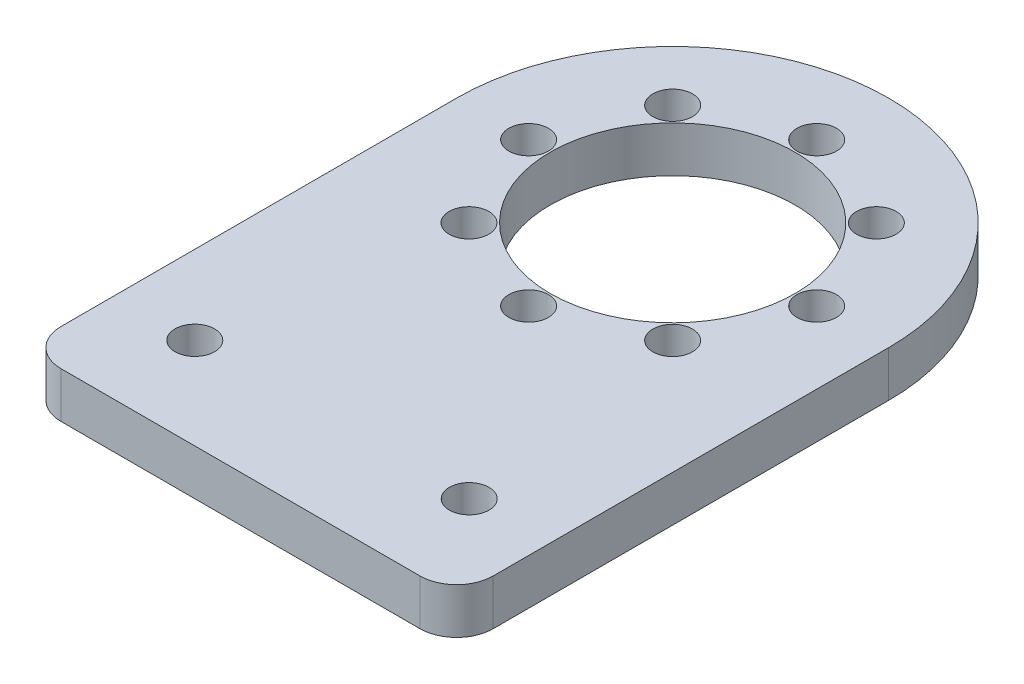
ISO-10303-21;
HEADER;
FILE_DESCRIPTION(('STEP AP214'),'2;1');
FILE_NAME('part.step','',(''),(''),'','','');
FILE_SCHEMA(('AUTOMOTIVE_DESIGN { 1 0 10303 214 1 1 1 1 }'));
ENDSEC;
DATA;
#1=APPLICATION_CONTEXT('core data for automotive mechanical design processes');
#2=APPLICATION_PROTOCOL_DEFINITION('international standard','automotive_design',2000,#1);
#3=PRODUCT_CONTEXT('',#1,'mechanical');
#4=PRODUCT('Part','Part','',(#3));
#5=PRODUCT_RELATED_PRODUCT_CATEGORY('part','',(#4));
#6=PRODUCT_DEFINITION_FORMATION('','',#4);
#7=PRODUCT_DEFINITION_CONTEXT('part definition',#1,'design');
#8=PRODUCT_DEFINITION('design','',#6,#7);
#9=PRODUCT_DEFINITION_SHAPE('','',#8);
#10=(LENGTH_UNIT() NAMED_UNIT(*) SI_UNIT(.MILLI.,.METRE.));
#11=(NAMED_UNIT(*) PLANE_ANGLE_UNIT() SI_UNIT($,.RADIAN.));
#12=(NAMED_UNIT(*) SI_UNIT($,.STERADIAN.) SOLID_ANGLE_UNIT());
#13=UNCERTAINTY_MEASURE_WITH_UNIT(LENGTH_MEASURE(1.E-05),#10,'distance_accuracy_value','');
#14=(GEOMETRIC_REPRESENTATION_CONTEXT(3) GLOBAL_UNCERTAINTY_ASSIGNED_CONTEXT((#13)) GLOBAL_UNIT_ASSIGNED_CONTEXT((#10,
#11,#12)) REPRESENTATION_CONTEXT('',''));
#15=CARTESIAN_POINT('',(0.,0.,0.));
#16=DIRECTION('',(0.,0.,1.));
#17=DIRECTION('',(1.,0.,0.));
#18=AXIS2_PLACEMENT_3D('',#15,#16,#17);
#19=CARTESIAN_POINT('',(0.,6.35,0.));
#20=DIRECTION('',(-1.,0.,0.));
#21=DIRECTION('',(0.,0.,1.));
#22=AXIS2_PLACEMENT_3D('',#19,#20,#21);
#23=PLANE('',#22);
#24=DIRECTION('',(0.,0.,-1.));
#25=VECTOR('',#24,1.);
#26=CARTESIAN_POINT('',(0.,0.,0.));
#27=LINE('',#26,#25);
#28=CARTESIAN_POINT('',(0.,0.,-5.08));
#29=VERTEX_POINT('',#28);
#30=CARTESIAN_POINT('',(0.,0.,-60.));
#31=VERTEX_POINT('',#30);
#32=EDGE_CURVE('E116',#29,#31,#27,.T.);
#33=ORIENTED_EDGE('',*,*,#32,.F.);
#34=DIRECTION('',(0.,-1.,0.));
#35=VECTOR('',#34,1.);
#36=CARTESIAN_POINT('',(0.,6.35,-5.08));
#37=LINE('',#36,#35);
#38=CARTESIAN_POINT('',(0.,6.35,-5.08));
#39=VERTEX_POINT('',#38);
#40=EDGE_CURVE('E11',#29,#39,#37,.F.);
#41=ORIENTED_EDGE('',*,*,#40,.T.);
#42=DIRECTION('',(0.,0.,-1.));
#43=VECTOR('',#42,1.);
#44=CARTESIAN_POINT('',(0.,6.35,0.));
#45=LINE('',#44,#43);
#46=CARTESIAN_POINT('',(0.,6.35,-60.));
#47=VERTEX_POINT('',#46);
#48=EDGE_CURVE('E123',#39,#47,#45,.T.);
#49=ORIENTED_EDGE('',*,*,#48,.T.);
#50=DIRECTION('',(0.,-1.,0.));
#51=VECTOR('',#50,1.);
#52=CARTESIAN_POINT('',(0.,6.35,-60.));
#53=LINE('',#52,#51);
#54=EDGE_CURVE('E108',#47,#31,#53,.T.);
#55=ORIENTED_EDGE('',*,*,#54,.T.);
#56=EDGE_LOOP('',(#33,#41,#49,#55));
#57=FACE_BOUND('',#56,.T.);
#58=ADVANCED_FACE('F33',(#57),#23,.T.);
#59=CARTESIAN_POINT('',(0.,6.35,0.));
#60=DIRECTION('',(0.,0.,-1.));
#61=DIRECTION('',(-1.,0.,0.));
#62=AXIS2_PLACEMENT_3D('',#59,#60,#61);
#63=PLANE('',#62);
#64=DIRECTION('',(1.,0.,0.));
#65=VECTOR('',#64,1.);
#66=CARTESIAN_POINT('',(0.,0.,0.));
#67=LINE('',#66,#65);
#68=CARTESIAN_POINT('',(5.08,0.,0.));
#69=VERTEX_POINT('',#68);
#70=CARTESIAN_POINT('',(54.92,0.,0.));
#71=VERTEX_POINT('',#70);
#72=EDGE_CURVE('E118',#69,#71,#67,.T.);
#73=ORIENTED_EDGE('',*,*,#72,.T.);
#74=DIRECTION('',(0.,-1.,0.));
#75=VECTOR('',#74,1.);
#76=CARTESIAN_POINT('',(54.92,6.35,0.));
#77=LINE('',#76,#75);
#78=CARTESIAN_POINT('',(54.92,6.35,0.));
#79=VERTEX_POINT('',#78);
#80=EDGE_CURVE('E54',#71,#79,#77,.F.);
#81=ORIENTED_EDGE('',*,*,#80,.T.);
#82=DIRECTION('',(1.,0.,0.));
#83=VECTOR('',#82,1.);
#84=CARTESIAN_POINT('',(0.,6.35,0.));
#85=LINE('',#84,#83);
#86=CARTESIAN_POINT('',(5.08,6.35,0.));
#87=VERTEX_POINT('',#86);
#88=EDGE_CURVE('E97',#87,#79,#85,.T.);
#89=ORIENTED_EDGE('',*,*,#88,.F.);
#90=DIRECTION('',(0.,-1.,0.));
#91=VECTOR('',#90,1.);
#92=CARTESIAN_POINT('',(5.08,0.,0.));
#93=LINE('',#92,#91);
#94=EDGE_CURVE('E130',#87,#69,#93,.T.);
#95=ORIENTED_EDGE('',*,*,#94,.T.);
#96=EDGE_LOOP('',(#73,#81,#89,#95));
#97=FACE_BOUND('',#96,.T.);
#98=ADVANCED_FACE('F138',(#97),#63,.F.);
#99=CARTESIAN_POINT('',(60.,6.35,0.));
#100=DIRECTION('',(-1.,0.,0.));
#101=DIRECTION('',(0.,0.,1.));
#102=AXIS2_PLACEMENT_3D('',#99,#100,#101);
#103=PLANE('',#102);
#104=DIRECTION('',(0.,0.,-1.));
#105=VECTOR('',#104,1.);
#106=CARTESIAN_POINT('',(60.,6.35,0.));
#107=LINE('',#106,#105);
#108=CARTESIAN_POINT('',(60.,6.35,-5.08));
#109=VERTEX_POINT('',#108);
#110=CARTESIAN_POINT('',(60.,6.35,-60.));
#111=VERTEX_POINT('',#110);
#112=EDGE_CURVE('E87',#109,#111,#107,.T.);
#113=ORIENTED_EDGE('',*,*,#112,.F.);
#114=DIRECTION('',(0.,-1.,0.));
#115=VECTOR('',#114,1.);
#116=CARTESIAN_POINT('',(60.,6.35,-5.08));
#117=LINE('',#116,#115);
#118=CARTESIAN_POINT('',(60.,0.,-5.08));
#119=VERTEX_POINT('',#118);
#120=EDGE_CURVE('E107',#109,#119,#117,.T.);
#121=ORIENTED_EDGE('',*,*,#120,.T.);
#122=DIRECTION('',(0.,0.,-1.));
#123=VECTOR('',#122,1.);
#124=CARTESIAN_POINT('',(60.,0.,0.));
#125=LINE('',#124,#123);
#126=CARTESIAN_POINT('',(60.,0.,-60.));
#127=VERTEX_POINT('',#126);
#128=EDGE_CURVE('E103',#119,#127,#125,.T.);
#129=ORIENTED_EDGE('',*,*,#128,.T.);
#130=DIRECTION('',(0.,-1.,0.));
#131=VECTOR('',#130,1.);
#132=CARTESIAN_POINT('',(60.,6.35,-60.));
#133=LINE('',#132,#131);
#134=EDGE_CURVE('E100',#111,#127,#133,.T.);
#135=ORIENTED_EDGE('',*,*,#134,.F.);
#136=EDGE_LOOP('',(#113,#121,#129,#135));
#137=FACE_BOUND('',#136,.T.);
#138=ADVANCED_FACE('F101',(#137),#103,.F.);
#139=CARTESIAN_POINT('',(30.,6.35,-60.));
#140=DIRECTION('',(0.,-1.,0.));
#141=DIRECTION('',(0.,0.,-1.));
#142=AXIS2_PLACEMENT_3D('',#139,#140,#141);
#143=CYLINDRICAL_SURFACE('',#142,30.);
#144=CARTESIAN_POINT('',(30.,0.,-60.));
#145=DIRECTION('',(0.,1.,0.));
#146=DIRECTION('',(0.,0.,1.));
#147=AXIS2_PLACEMENT_3D('',#144,#145,#146);
#148=CIRCLE('',#147,30.);
#149=EDGE_CURVE('E122',#127,#31,#148,.T.);
#150=ORIENTED_EDGE('',*,*,#149,.T.);
#151=ORIENTED_EDGE('',*,*,#54,.F.);
#152=CARTESIAN_POINT('',(30.,6.35,-60.));
#153=DIRECTION('',(0.,1.,0.));
#154=DIRECTION('',(0.,0.,1.));
#155=AXIS2_PLACEMENT_3D('',#152,#153,#154);
#156=CIRCLE('',#155,30.);
#157=EDGE_CURVE('E91',#111,#47,#156,.T.);
#158=ORIENTED_EDGE('',*,*,#157,.F.);
#159=ORIENTED_EDGE('',*,*,#134,.T.);
#160=EDGE_LOOP('',(#150,#151,#158,#159));
#161=FACE_BOUND('',#160,.T.);
#162=ADVANCED_FACE('F110',(#161),#143,.T.);
#163=CARTESIAN_POINT('',(0.,6.35,0.));
#164=DIRECTION('',(0.,1.,0.));
#165=DIRECTION('',(0.,0.,1.));
#166=AXIS2_PLACEMENT_3D('',#163,#164,#165);
#167=PLANE('',#166);
#168=CARTESIAN_POINT('',(10.95,6.35,-12.7));
#169=DIRECTION('',(0.,1.,0.));
#170=DIRECTION('',(0.,0.,1.));
#171=AXIS2_PLACEMENT_3D('',#168,#169,#170);
#172=CIRCLE('',#171,2.74999999999999);
#173=CARTESIAN_POINT('',(10.95,6.35,-9.95000000000001));
#174=VERTEX_POINT('',#173);
#175=EDGE_CURVE('E223',#174,#174,#172,.T.);
#176=ORIENTED_EDGE('',*,*,#175,.F.);
#177=EDGE_LOOP('',(#176));
#178=FACE_BOUND('',#177,.T.);
#179=CARTESIAN_POINT('',(49.05,6.35,-12.7));
#180=DIRECTION('',(0.,1.,0.));
#181=DIRECTION('',(0.,0.,1.));
#182=AXIS2_PLACEMENT_3D('',#179,#180,#181);
#183=CIRCLE('',#182,2.74999999999999);
#184=CARTESIAN_POINT('',(49.05,6.35,-9.95000000000002));
#185=VERTEX_POINT('',#184);
#186=EDGE_CURVE('E216',#185,#185,#183,.T.);
#187=ORIENTED_EDGE('',*,*,#186,.F.);
#188=EDGE_LOOP('',(#187));
#189=FACE_BOUND('',#188,.T.);
#190=CARTESIAN_POINT('',(15.8578643762691,6.35,-74.142135623731));
#191=DIRECTION('',(0.,1.,0.));
#192=DIRECTION('',(0.,0.,1.));
#193=AXIS2_PLACEMENT_3D('',#190,#191,#192);
#194=CIRCLE('',#193,2.75);
#195=CARTESIAN_POINT('',(15.8578643762691,6.35,-71.392135623731));
#196=VERTEX_POINT('',#195);
#197=EDGE_CURVE('E220',#196,#196,#194,.T.);
#198=ORIENTED_EDGE('',*,*,#197,.F.);
#199=EDGE_LOOP('',(#198));
#200=FACE_BOUND('',#199,.T.);
#201=CARTESIAN_POINT('',(44.1421356237309,6.35,-45.857864376269));
#202=DIRECTION('',(0.,1.,0.));
#203=DIRECTION('',(0.,0.,1.));
#204=AXIS2_PLACEMENT_3D('',#201,#202,#203);
#205=CIRCLE('',#204,2.75);
#206=CARTESIAN_POINT('',(44.1421356237309,6.35,-43.107864376269));
#207=VERTEX_POINT('',#206);
#208=EDGE_CURVE('E232',#207,#207,#205,.T.);
#209=ORIENTED_EDGE('',*,*,#208,.F.);
#210=EDGE_LOOP('',(#209));
#211=FACE_BOUND('',#210,.T.);
#212=CARTESIAN_POINT('',(44.142135623731,6.35,-74.1421356237309));
#213=DIRECTION('',(0.,1.,0.));
#214=DIRECTION('',(0.,0.,1.));
#215=AXIS2_PLACEMENT_3D('',#212,#213,#214);
#216=CIRCLE('',#215,2.75);
#217=CARTESIAN_POINT('',(44.142135623731,6.35,-71.3921356237309));
#218=VERTEX_POINT('',#217);
#219=EDGE_CURVE('E238',#218,#218,#216,.T.);
#220=ORIENTED_EDGE('',*,*,#219,.F.);
#221=EDGE_LOOP('',(#220));
#222=FACE_BOUND('',#221,.T.);
#223=CARTESIAN_POINT('',(15.857864376269,6.35,-45.8578643762691));
#224=DIRECTION('',(0.,1.,0.));
#225=DIRECTION('',(0.,0.,1.));
#226=AXIS2_PLACEMENT_3D('',#223,#224,#225);
#227=CIRCLE('',#226,2.75);
#228=CARTESIAN_POINT('',(15.857864376269,6.35,-43.1078643762691));
#229=VERTEX_POINT('',#228);
#230=EDGE_CURVE('E244',#229,#229,#227,.T.);
#231=ORIENTED_EDGE('',*,*,#230,.F.);
#232=EDGE_LOOP('',(#231));
#233=FACE_BOUND('',#232,.T.);
#234=CARTESIAN_POINT('',(30.,6.35,-80.));
#235=DIRECTION('',(0.,1.,0.));
#236=DIRECTION('',(0.,0.,1.));
#237=AXIS2_PLACEMENT_3D('',#234,#235,#236);
#238=CIRCLE('',#237,2.75);
#239=CARTESIAN_POINT('',(30.,6.35,-77.25));
#240=VERTEX_POINT('',#239);
#241=EDGE_CURVE('E250',#240,#240,#238,.T.);
#242=ORIENTED_EDGE('',*,*,#241,.F.);
#243=EDGE_LOOP('',(#242));
#244=FACE_BOUND('',#243,.T.);
#245=CARTESIAN_POINT('',(50.,6.35,-60.));
#246=DIRECTION('',(0.,1.,0.));
#247=DIRECTION('',(0.,0.,1.));
#248=AXIS2_PLACEMENT_3D('',#245,#246,#247);
#249=CIRCLE('',#248,2.75);
#250=CARTESIAN_POINT('',(50.,6.35,-57.25));
#251=VERTEX_POINT('',#250);
#252=EDGE_CURVE('E256',#251,#251,#249,.T.);
#253=ORIENTED_EDGE('',*,*,#252,.F.);
#254=EDGE_LOOP('',(#253));
#255=FACE_BOUND('',#254,.T.);
#256=CARTESIAN_POINT('',(30.,6.35,-40.));
#257=DIRECTION('',(0.,1.,0.));
#258=DIRECTION('',(0.,0.,1.));
#259=AXIS2_PLACEMENT_3D('',#256,#257,#258);
#260=CIRCLE('',#259,2.75);
#261=CARTESIAN_POINT('',(30.,6.35,-37.25));
#262=VERTEX_POINT('',#261);
#263=EDGE_CURVE('E262',#262,#262,#260,.T.);
#264=ORIENTED_EDGE('',*,*,#263,.F.);
#265=EDGE_LOOP('',(#264));
#266=FACE_BOUND('',#265,.T.);
#267=CARTESIAN_POINT('',(9.99999999999999,6.35,-60.));
#268=DIRECTION('',(0.,1.,0.));
#269=DIRECTION('',(0.,0.,1.));
#270=AXIS2_PLACEMENT_3D('',#267,#268,#269);
#271=CIRCLE('',#270,2.75);
#272=CARTESIAN_POINT('',(9.99999999999999,6.35,-57.25));
#273=VERTEX_POINT('',#272);
#274=EDGE_CURVE('E268',#273,#273,#271,.T.);
#275=ORIENTED_EDGE('',*,*,#274,.F.);
#276=EDGE_LOOP('',(#275));
#277=FACE_BOUND('',#276,.T.);
#278=CARTESIAN_POINT('',(30.,6.35,-60.));
#279=DIRECTION('',(0.,1.,0.));
#280=DIRECTION('',(0.,0.,1.));
#281=AXIS2_PLACEMENT_3D('',#278,#279,#280);
#282=CIRCLE('',#281,17.);
#283=CARTESIAN_POINT('',(30.,6.35,-43.));
#284=VERTEX_POINT('',#283);
#285=EDGE_CURVE('E274',#284,#284,#282,.T.);
#286=ORIENTED_EDGE('',*,*,#285,.F.);
#287=EDGE_LOOP('',(#286));
#288=FACE_BOUND('',#287,.T.);
#289=ORIENTED_EDGE('',*,*,#88,.T.);
#290=CARTESIAN_POINT('',(54.92,6.35,-5.08));
#291=DIRECTION('',(0.,1.,0.));
#292=DIRECTION('',(0.,0.,1.));
#293=AXIS2_PLACEMENT_3D('',#290,#291,#292);
#294=CIRCLE('',#293,5.08);
#295=EDGE_CURVE('E41',#79,#109,#294,.T.);
#296=ORIENTED_EDGE('',*,*,#295,.T.);
#297=ORIENTED_EDGE('',*,*,#112,.T.);
#298=ORIENTED_EDGE('',*,*,#157,.T.);
#299=ORIENTED_EDGE('',*,*,#48,.F.);
#300=CARTESIAN_POINT('',(5.08,6.35,-5.08));
#301=DIRECTION('',(0.,1.,0.));
#302=DIRECTION('',(0.,0.,1.));
#303=AXIS2_PLACEMENT_3D('',#300,#301,#302);
#304=CIRCLE('',#303,5.08);
#305=EDGE_CURVE('E134',#39,#87,#304,.T.);
#306=ORIENTED_EDGE('',*,*,#305,.T.);
#307=EDGE_LOOP('',(#289,#296,#297,#298,#299,#306));
#308=FACE_BOUND('',#307,.T.);
#309=ADVANCED_FACE('F89',(#178,#189,#200,#211,#222,#233,#244,#255,#266,#277,#288,#308),#167,.T.);
#310=CARTESIAN_POINT('',(0.,0.,0.));
#311=DIRECTION('',(0.,1.,0.));
#312=DIRECTION('',(0.,0.,1.));
#313=AXIS2_PLACEMENT_3D('',#310,#311,#312);
#314=PLANE('',#313);
#315=CARTESIAN_POINT('',(10.95,0.,-12.7));
#316=DIRECTION('',(0.,1.,0.));
#317=DIRECTION('',(0.,0.,1.));
#318=AXIS2_PLACEMENT_3D('',#315,#316,#317);
#319=CIRCLE('',#318,2.75);
#320=CARTESIAN_POINT('',(10.95,0.,-9.95));
#321=VERTEX_POINT('',#320);
#322=EDGE_CURVE('E218',#321,#321,#319,.T.);
#323=ORIENTED_EDGE('',*,*,#322,.T.);
#324=EDGE_LOOP('',(#323));
#325=FACE_BOUND('',#324,.T.);
#326=CARTESIAN_POINT('',(49.05,0.,-12.7));
#327=DIRECTION('',(0.,1.,0.));
#328=DIRECTION('',(0.,0.,1.));
#329=AXIS2_PLACEMENT_3D('',#326,#327,#328);
#330=CIRCLE('',#329,2.75);
#331=CARTESIAN_POINT('',(49.05,0.,-9.95000000000001));
#332=VERTEX_POINT('',#331);
#333=EDGE_CURVE('E213',#332,#332,#330,.T.);
#334=ORIENTED_EDGE('',*,*,#333,.T.);
#335=EDGE_LOOP('',(#334));
#336=FACE_BOUND('',#335,.T.);
#337=CARTESIAN_POINT('',(15.8578643762691,0.,-74.142135623731));
#338=DIRECTION('',(0.,1.,0.));
#339=DIRECTION('',(0.,0.,1.));
#340=AXIS2_PLACEMENT_3D('',#337,#338,#339);
#341=CIRCLE('',#340,2.75);
#342=CARTESIAN_POINT('',(15.8578643762691,0.,-71.392135623731));
#343=VERTEX_POINT('',#342);
#344=EDGE_CURVE('E229',#343,#343,#341,.T.);
#345=ORIENTED_EDGE('',*,*,#344,.T.);
#346=EDGE_LOOP('',(#345));
#347=FACE_BOUND('',#346,.T.);
#348=CARTESIAN_POINT('',(44.1421356237309,0.,-45.857864376269));
#349=DIRECTION('',(0.,1.,0.));
#350=DIRECTION('',(0.,0.,1.));
#351=AXIS2_PLACEMENT_3D('',#348,#349,#350);
#352=CIRCLE('',#351,2.75);
#353=CARTESIAN_POINT('',(44.1421356237309,0.,-43.107864376269));
#354=VERTEX_POINT('',#353);
#355=EDGE_CURVE('E235',#354,#354,#352,.T.);
#356=ORIENTED_EDGE('',*,*,#355,.T.);
#357=EDGE_LOOP('',(#356));
#358=FACE_BOUND('',#357,.T.);
#359=CARTESIAN_POINT('',(44.142135623731,0.,-74.1421356237309));
#360=DIRECTION('',(0.,1.,0.));
#361=DIRECTION('',(0.,0.,1.));
#362=AXIS2_PLACEMENT_3D('',#359,#360,#361);
#363=CIRCLE('',#362,2.75);
#364=CARTESIAN_POINT('',(44.142135623731,0.,-71.3921356237309));
#365=VERTEX_POINT('',#364);
#366=EDGE_CURVE('E241',#365,#365,#363,.T.);
#367=ORIENTED_EDGE('',*,*,#366,.T.);
#368=EDGE_LOOP('',(#367));
#369=FACE_BOUND('',#368,.T.);
#370=CARTESIAN_POINT('',(15.857864376269,0.,-45.8578643762691));
#371=DIRECTION('',(0.,1.,0.));
#372=DIRECTION('',(0.,0.,1.));
#373=AXIS2_PLACEMENT_3D('',#370,#371,#372);
#374=CIRCLE('',#373,2.75);
#375=CARTESIAN_POINT('',(15.857864376269,0.,-43.1078643762691));
#376=VERTEX_POINT('',#375);
#377=EDGE_CURVE('E247',#376,#376,#374,.T.);
#378=ORIENTED_EDGE('',*,*,#377,.T.);
#379=EDGE_LOOP('',(#378));
#380=FACE_BOUND('',#379,.T.);
#381=CARTESIAN_POINT('',(30.,0.,-80.));
#382=DIRECTION('',(0.,1.,0.));
#383=DIRECTION('',(0.,0.,1.));
#384=AXIS2_PLACEMENT_3D('',#381,#382,#383);
#385=CIRCLE('',#384,2.75);
#386=CARTESIAN_POINT('',(30.,0.,-77.25));
#387=VERTEX_POINT('',#386);
#388=EDGE_CURVE('E253',#387,#387,#385,.T.);
#389=ORIENTED_EDGE('',*,*,#388,.T.);
#390=EDGE_LOOP('',(#389));
#391=FACE_BOUND('',#390,.T.);
#392=CARTESIAN_POINT('',(50.,0.,-60.));
#393=DIRECTION('',(0.,1.,0.));
#394=DIRECTION('',(0.,0.,1.));
#395=AXIS2_PLACEMENT_3D('',#392,#393,#394);
#396=CIRCLE('',#395,2.75);
#397=CARTESIAN_POINT('',(50.,0.,-57.25));
#398=VERTEX_POINT('',#397);
#399=EDGE_CURVE('E259',#398,#398,#396,.T.);
#400=ORIENTED_EDGE('',*,*,#399,.T.);
#401=EDGE_LOOP('',(#400));
#402=FACE_BOUND('',#401,.T.);
#403=CARTESIAN_POINT('',(30.,0.,-40.));
#404=DIRECTION('',(0.,1.,0.));
#405=DIRECTION('',(0.,0.,1.));
#406=AXIS2_PLACEMENT_3D('',#403,#404,#405);
#407=CIRCLE('',#406,2.75);
#408=CARTESIAN_POINT('',(30.,0.,-37.25));
#409=VERTEX_POINT('',#408);
#410=EDGE_CURVE('E265',#409,#409,#407,.T.);
#411=ORIENTED_EDGE('',*,*,#410,.T.);
#412=EDGE_LOOP('',(#411));
#413=FACE_BOUND('',#412,.T.);
#414=CARTESIAN_POINT('',(9.99999999999999,0.,-60.));
#415=DIRECTION('',(0.,1.,0.));
#416=DIRECTION('',(0.,0.,1.));
#417=AXIS2_PLACEMENT_3D('',#414,#415,#416);
#418=CIRCLE('',#417,2.75);
#419=CARTESIAN_POINT('',(9.99999999999999,0.,-57.25));
#420=VERTEX_POINT('',#419);
#421=EDGE_CURVE('E271',#420,#420,#418,.T.);
#422=ORIENTED_EDGE('',*,*,#421,.T.);
#423=EDGE_LOOP('',(#422));
#424=FACE_BOUND('',#423,.T.);
#425=CARTESIAN_POINT('',(30.,0.,-60.));
#426=DIRECTION('',(0.,1.,0.));
#427=DIRECTION('',(0.,0.,1.));
#428=AXIS2_PLACEMENT_3D('',#425,#426,#427);
#429=CIRCLE('',#428,17.);
#430=CARTESIAN_POINT('',(30.,0.,-43.));
#431=VERTEX_POINT('',#430);
#432=EDGE_CURVE('E119',#431,#431,#429,.T.);
#433=ORIENTED_EDGE('',*,*,#432,.T.);
#434=EDGE_LOOP('',(#433));
#435=FACE_BOUND('',#434,.T.);
#436=ORIENTED_EDGE('',*,*,#128,.F.);
#437=CARTESIAN_POINT('',(54.92,0.,-5.08));
#438=DIRECTION('',(0.,1.,0.));
#439=DIRECTION('',(0.,0.,1.));
#440=AXIS2_PLACEMENT_3D('',#437,#438,#439);
#441=CIRCLE('',#440,5.08);
#442=EDGE_CURVE('E128',#119,#71,#441,.F.);
#443=ORIENTED_EDGE('',*,*,#442,.T.);
#444=ORIENTED_EDGE('',*,*,#72,.F.);
#445=CARTESIAN_POINT('',(5.08,0.,-5.08));
#446=DIRECTION('',(0.,1.,0.));
#447=DIRECTION('',(0.,0.,1.));
#448=AXIS2_PLACEMENT_3D('',#445,#446,#447);
#449=CIRCLE('',#448,5.08);
#450=EDGE_CURVE('E126',#69,#29,#449,.F.);
#451=ORIENTED_EDGE('',*,*,#450,.T.);
#452=ORIENTED_EDGE('',*,*,#32,.T.);
#453=ORIENTED_EDGE('',*,*,#149,.F.);
#454=EDGE_LOOP('',(#436,#443,#444,#451,#452,#453));
#455=FACE_BOUND('',#454,.T.);
#456=ADVANCED_FACE('F141',(#325,#336,#347,#358,#369,#380,#391,#402,#413,#424,#435,#455),#314,.F.);
#457=CARTESIAN_POINT('',(30.,0.,-60.));
#458=DIRECTION('',(0.,1.,0.));
#459=DIRECTION('',(0.,0.,1.));
#460=AXIS2_PLACEMENT_3D('',#457,#458,#459);
#461=CYLINDRICAL_SURFACE('',#460,17.);
#462=ORIENTED_EDGE('',*,*,#432,.F.);
#463=EDGE_LOOP('',(#462));
#464=FACE_BOUND('',#463,.T.);
#465=ORIENTED_EDGE('',*,*,#285,.T.);
#466=EDGE_LOOP('',(#465));
#467=FACE_BOUND('',#466,.T.);
#468=ADVANCED_FACE('F166',(#464,#467),#461,.F.);
#469=CARTESIAN_POINT('',(9.99999999999999,6.35,-60.));
#470=DIRECTION('',(0.,1.,0.));
#471=DIRECTION('',(0.,0.,1.));
#472=AXIS2_PLACEMENT_3D('',#469,#470,#471);
#473=CYLINDRICAL_SURFACE('',#472,2.75);
#474=ORIENTED_EDGE('',*,*,#421,.F.);
#475=EDGE_LOOP('',(#474));
#476=FACE_BOUND('',#475,.T.);
#477=ORIENTED_EDGE('',*,*,#274,.T.);
#478=EDGE_LOOP('',(#477));
#479=FACE_BOUND('',#478,.T.);
#480=ADVANCED_FACE('F173',(#476,#479),#473,.F.);
#481=CARTESIAN_POINT('',(30.,6.35,-40.));
#482=DIRECTION('',(0.,1.,0.));
#483=DIRECTION('',(0.,0.,1.));
#484=AXIS2_PLACEMENT_3D('',#481,#482,#483);
#485=CYLINDRICAL_SURFACE('',#484,2.75);
#486=ORIENTED_EDGE('',*,*,#410,.F.);
#487=EDGE_LOOP('',(#486));
#488=FACE_BOUND('',#487,.T.);
#489=ORIENTED_EDGE('',*,*,#263,.T.);
#490=EDGE_LOOP('',(#489));
#491=FACE_BOUND('',#490,.T.);
#492=ADVANCED_FACE('F177',(#488,#491),#485,.F.);
#493=CARTESIAN_POINT('',(50.,6.35,-60.));
#494=DIRECTION('',(0.,1.,0.));
#495=DIRECTION('',(0.,0.,1.));
#496=AXIS2_PLACEMENT_3D('',#493,#494,#495);
#497=CYLINDRICAL_SURFACE('',#496,2.75);
#498=ORIENTED_EDGE('',*,*,#399,.F.);
#499=EDGE_LOOP('',(#498));
#500=FACE_BOUND('',#499,.T.);
#501=ORIENTED_EDGE('',*,*,#252,.T.);
#502=EDGE_LOOP('',(#501));
#503=FACE_BOUND('',#502,.T.);
#504=ADVANCED_FACE('F181',(#500,#503),#497,.F.);
#505=CARTESIAN_POINT('',(30.,6.35,-80.));
#506=DIRECTION('',(0.,1.,0.));
#507=DIRECTION('',(0.,0.,1.));
#508=AXIS2_PLACEMENT_3D('',#505,#506,#507);
#509=CYLINDRICAL_SURFACE('',#508,2.75);
#510=ORIENTED_EDGE('',*,*,#388,.F.);
#511=EDGE_LOOP('',(#510));
#512=FACE_BOUND('',#511,.T.);
#513=ORIENTED_EDGE('',*,*,#241,.T.);
#514=EDGE_LOOP('',(#513));
#515=FACE_BOUND('',#514,.T.);
#516=ADVANCED_FACE('F185',(#512,#515),#509,.F.);
#517=CARTESIAN_POINT('',(15.857864376269,6.35,-45.8578643762691));
#518=DIRECTION('',(0.,1.,0.));
#519=DIRECTION('',(0.,0.,1.));
#520=AXIS2_PLACEMENT_3D('',#517,#518,#519);
#521=CYLINDRICAL_SURFACE('',#520,2.75);
#522=ORIENTED_EDGE('',*,*,#377,.F.);
#523=EDGE_LOOP('',(#522));
#524=FACE_BOUND('',#523,.T.);
#525=ORIENTED_EDGE('',*,*,#230,.T.);
#526=EDGE_LOOP('',(#525));
#527=FACE_BOUND('',#526,.T.);
#528=ADVANCED_FACE('F189',(#524,#527),#521,.F.);
#529=CARTESIAN_POINT('',(44.142135623731,6.35,-74.1421356237309));
#530=DIRECTION('',(0.,1.,0.));
#531=DIRECTION('',(0.,0.,1.));
#532=AXIS2_PLACEMENT_3D('',#529,#530,#531);
#533=CYLINDRICAL_SURFACE('',#532,2.75);
#534=ORIENTED_EDGE('',*,*,#366,.F.);
#535=EDGE_LOOP('',(#534));
#536=FACE_BOUND('',#535,.T.);
#537=ORIENTED_EDGE('',*,*,#219,.T.);
#538=EDGE_LOOP('',(#537));
#539=FACE_BOUND('',#538,.T.);
#540=ADVANCED_FACE('F193',(#536,#539),#533,.F.);
#541=CARTESIAN_POINT('',(44.1421356237309,6.35,-45.857864376269));
#542=DIRECTION('',(0.,1.,0.));
#543=DIRECTION('',(0.,0.,1.));
#544=AXIS2_PLACEMENT_3D('',#541,#542,#543);
#545=CYLINDRICAL_SURFACE('',#544,2.75);
#546=ORIENTED_EDGE('',*,*,#355,.F.);
#547=EDGE_LOOP('',(#546));
#548=FACE_BOUND('',#547,.T.);
#549=ORIENTED_EDGE('',*,*,#208,.T.);
#550=EDGE_LOOP('',(#549));
#551=FACE_BOUND('',#550,.T.);
#552=ADVANCED_FACE('F197',(#548,#551),#545,.F.);
#553=CARTESIAN_POINT('',(15.8578643762691,6.35,-74.142135623731));
#554=DIRECTION('',(0.,1.,0.));
#555=DIRECTION('',(0.,0.,1.));
#556=AXIS2_PLACEMENT_3D('',#553,#554,#555);
#557=CYLINDRICAL_SURFACE('',#556,2.75);
#558=ORIENTED_EDGE('',*,*,#344,.F.);
#559=EDGE_LOOP('',(#558));
#560=FACE_BOUND('',#559,.T.);
#561=ORIENTED_EDGE('',*,*,#197,.T.);
#562=EDGE_LOOP('',(#561));
#563=FACE_BOUND('',#562,.T.);
#564=ADVANCED_FACE('F201',(#560,#563),#557,.F.);
#565=CARTESIAN_POINT('',(49.05,6.35,-12.7));
#566=DIRECTION('',(0.,1.,0.));
#567=DIRECTION('',(0.,0.,1.));
#568=AXIS2_PLACEMENT_3D('',#565,#566,#567);
#569=CYLINDRICAL_SURFACE('',#568,2.74999999999999);
#570=ORIENTED_EDGE('',*,*,#333,.F.);
#571=EDGE_LOOP('',(#570));
#572=FACE_BOUND('',#571,.T.);
#573=ORIENTED_EDGE('',*,*,#186,.T.);
#574=EDGE_LOOP('',(#573));
#575=FACE_BOUND('',#574,.T.);
#576=ADVANCED_FACE('F150',(#572,#575),#569,.F.);
#577=CARTESIAN_POINT('',(10.95,6.35,-12.7));
#578=DIRECTION('',(0.,1.,0.));
#579=DIRECTION('',(0.,0.,1.));
#580=AXIS2_PLACEMENT_3D('',#577,#578,#579);
#581=CYLINDRICAL_SURFACE('',#580,2.74999999999999);
#582=ORIENTED_EDGE('',*,*,#322,.F.);
#583=EDGE_LOOP('',(#582));
#584=FACE_BOUND('',#583,.T.);
#585=ORIENTED_EDGE('',*,*,#175,.T.);
#586=EDGE_LOOP('',(#585));
#587=FACE_BOUND('',#586,.T.);
#588=ADVANCED_FACE('F145',(#584,#587),#581,.F.);
#589=CARTESIAN_POINT('',(54.92,6.35,-5.08));
#590=DIRECTION('',(0.,-1.,0.));
#591=DIRECTION('',(0.,0.,-1.));
#592=AXIS2_PLACEMENT_3D('',#589,#590,#591);
#593=CYLINDRICAL_SURFACE('',#592,5.08);
#594=ORIENTED_EDGE('',*,*,#295,.F.);
#595=ORIENTED_EDGE('',*,*,#80,.F.);
#596=ORIENTED_EDGE('',*,*,#442,.F.);
#597=ORIENTED_EDGE('',*,*,#120,.F.);
#598=EDGE_LOOP('',(#594,#595,#596,#597));
#599=FACE_BOUND('',#598,.T.);
#600=ADVANCED_FACE('F143',(#599),#593,.T.);
#601=CARTESIAN_POINT('',(5.08,6.35,-5.08));
#602=DIRECTION('',(0.,1.,0.));
#603=DIRECTION('',(0.,0.,1.));
#604=AXIS2_PLACEMENT_3D('',#601,#602,#603);
#605=CYLINDRICAL_SURFACE('',#604,5.08);
#606=ORIENTED_EDGE('',*,*,#305,.F.);
#607=ORIENTED_EDGE('',*,*,#40,.F.);
#608=ORIENTED_EDGE('',*,*,#450,.F.);
#609=ORIENTED_EDGE('',*,*,#94,.F.);
#610=EDGE_LOOP('',(#606,#607,#608,#609));
#611=FACE_BOUND('',#610,.T.);
#612=ADVANCED_FACE('F35',(#611),#605,.T.);
#613=CLOSED_SHELL('',(#58,#98,#138,#162,#309,#456,#468,#480,#492,#504,#516,#528,#540,#552,#564,
#576,#588,#600,#612));
#614=MANIFOLD_SOLID_BREP('B2',#613);
#615=ADVANCED_BREP_SHAPE_REPRESENTATION('',(#18,#614),#14);
#616=SHAPE_DEFINITION_REPRESENTATION(#9,#615);
ENDSEC;
END-ISO-10303-21;
